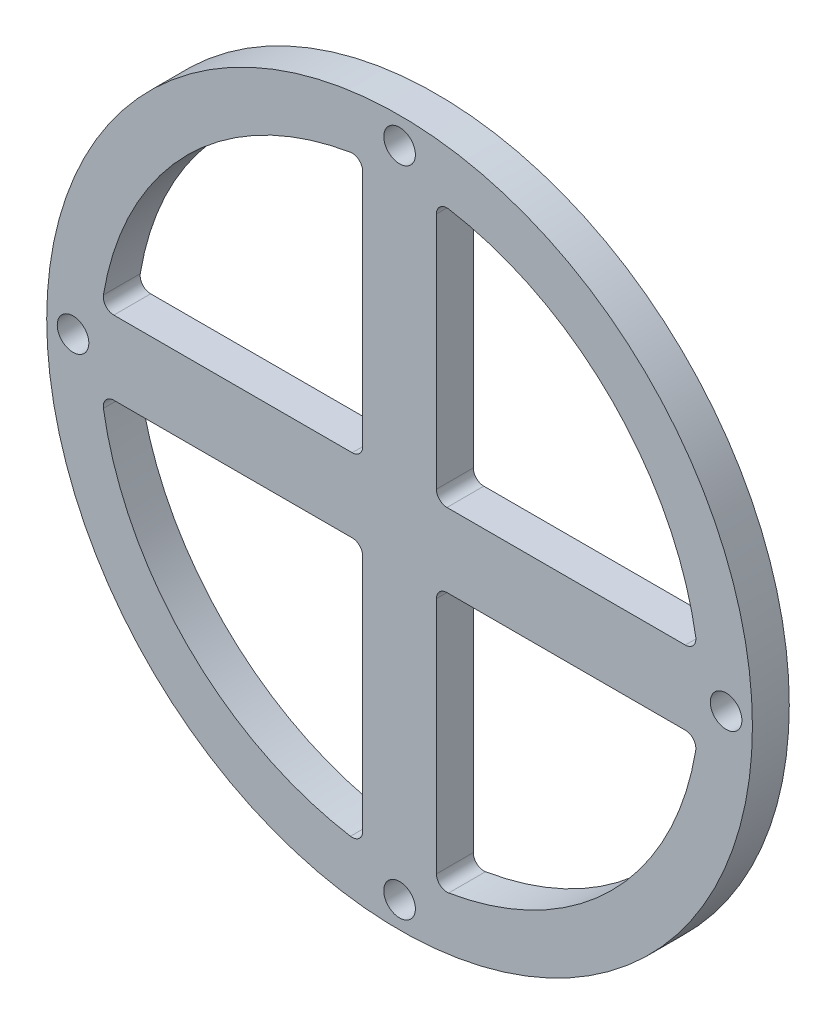
ISO-10303-21;
HEADER;
FILE_DESCRIPTION(('STEP AP214'),'2;1');
FILE_NAME('part.step','',(''),(''),'','','');
FILE_SCHEMA(('AUTOMOTIVE_DESIGN { 1 0 10303 214 1 1 1 1 }'));
ENDSEC;
DATA;
#1=APPLICATION_CONTEXT('core data for automotive mechanical design processes');
#2=APPLICATION_PROTOCOL_DEFINITION('international standard','automotive_design',2000,#1);
#3=PRODUCT_CONTEXT('',#1,'mechanical');
#4=PRODUCT('Part','Part','',(#3));
#5=PRODUCT_RELATED_PRODUCT_CATEGORY('part','',(#4));
#6=PRODUCT_DEFINITION_FORMATION('','',#4);
#7=PRODUCT_DEFINITION_CONTEXT('part definition',#1,'design');
#8=PRODUCT_DEFINITION('design','',#6,#7);
#9=PRODUCT_DEFINITION_SHAPE('','',#8);
#10=(LENGTH_UNIT() NAMED_UNIT(*) SI_UNIT(.MILLI.,.METRE.));
#11=(NAMED_UNIT(*) PLANE_ANGLE_UNIT() SI_UNIT($,.RADIAN.));
#12=(NAMED_UNIT(*) SI_UNIT($,.STERADIAN.) SOLID_ANGLE_UNIT());
#13=UNCERTAINTY_MEASURE_WITH_UNIT(LENGTH_MEASURE(1.E-05),#10,'distance_accuracy_value','');
#14=(GEOMETRIC_REPRESENTATION_CONTEXT(3) GLOBAL_UNCERTAINTY_ASSIGNED_CONTEXT((#13)) GLOBAL_UNIT_ASSIGNED_CONTEXT((#10,
#11,#12)) REPRESENTATION_CONTEXT('',''));
#15=CARTESIAN_POINT('',(0.,0.,0.));
#16=DIRECTION('',(0.,0.,1.));
#17=DIRECTION('',(1.,0.,0.));
#18=AXIS2_PLACEMENT_3D('',#15,#16,#17);
#19=CARTESIAN_POINT('',(0.,0.,7.));
#20=DIRECTION('',(0.,0.,-1.));
#21=DIRECTION('',(-1.,0.,0.));
#22=AXIS2_PLACEMENT_3D('',#19,#20,#21);
#23=CYLINDRICAL_SURFACE('',#22,57.);
#24=CARTESIAN_POINT('',(0.,0.,0.));
#25=DIRECTION('',(0.,0.,1.));
#26=DIRECTION('',(1.,0.,0.));
#27=AXIS2_PLACEMENT_3D('',#24,#25,#26);
#28=CIRCLE('',#27,57.);
#29=CARTESIAN_POINT('',(-56.2316813146386,-9.3272727272727,0.));
#30=VERTEX_POINT('',#29);
#31=CARTESIAN_POINT('',(-9.32727272727235,-56.2316813146386,0.));
#32=VERTEX_POINT('',#31);
#33=EDGE_CURVE('E289',#30,#32,#28,.T.);
#34=ORIENTED_EDGE('',*,*,#33,.F.);
#35=DIRECTION('',(0.,0.,-1.));
#36=VECTOR('',#35,1.);
#37=CARTESIAN_POINT('',(-56.2316813146386,-9.3272727272727,7.));
#38=LINE('',#37,#36);
#39=CARTESIAN_POINT('',(-56.2316813146386,-9.3272727272727,7.));
#40=VERTEX_POINT('',#39);
#41=EDGE_CURVE('E11',#40,#30,#38,.T.);
#42=ORIENTED_EDGE('',*,*,#41,.F.);
#43=CARTESIAN_POINT('',(0.,0.,7.));
#44=DIRECTION('',(0.,0.,1.));
#45=DIRECTION('',(1.,0.,0.));
#46=AXIS2_PLACEMENT_3D('',#43,#44,#45);
#47=CIRCLE('',#46,57.);
#48=CARTESIAN_POINT('',(-9.32727272727235,-56.2316813146386,7.));
#49=VERTEX_POINT('',#48);
#50=EDGE_CURVE('E418',#40,#49,#47,.T.);
#51=ORIENTED_EDGE('',*,*,#50,.T.);
#52=DIRECTION('',(0.,0.,-1.));
#53=VECTOR('',#52,1.);
#54=CARTESIAN_POINT('',(-9.32727272727235,-56.2316813146386,7.));
#55=LINE('',#54,#53);
#56=EDGE_CURVE('E54',#49,#32,#55,.T.);
#57=ORIENTED_EDGE('',*,*,#56,.T.);
#58=EDGE_LOOP('',(#34,#42,#51,#57));
#59=FACE_BOUND('',#58,.T.);
#60=ADVANCED_FACE('F35',(#59),#23,.F.);
#61=CARTESIAN_POINT('',(-54.2586398650022,-9.,7.));
#62=DIRECTION('',(0.,0.,-1.));
#63=DIRECTION('',(-1.,0.,0.));
#64=AXIS2_PLACEMENT_3D('',#61,#62,#63);
#65=CYLINDRICAL_SURFACE('',#64,2.00000000000001);
#66=CARTESIAN_POINT('',(-54.2586398650022,-9.,0.));
#67=DIRECTION('',(0.,0.,1.));
#68=DIRECTION('',(1.,0.,0.));
#69=AXIS2_PLACEMENT_3D('',#66,#67,#68);
#70=CIRCLE('',#69,2.00000000000001);
#71=CARTESIAN_POINT('',(-54.2586398650022,-7.,0.));
#72=VERTEX_POINT('',#71);
#73=EDGE_CURVE('E291',#30,#72,#70,.F.);
#74=ORIENTED_EDGE('',*,*,#73,.T.);
#75=DIRECTION('',(0.,0.,-1.));
#76=VECTOR('',#75,1.);
#77=CARTESIAN_POINT('',(-54.2586398650022,-7.,7.));
#78=LINE('',#77,#76);
#79=CARTESIAN_POINT('',(-54.2586398650022,-7.,7.));
#80=VERTEX_POINT('',#79);
#81=EDGE_CURVE('E45',#80,#72,#78,.T.);
#82=ORIENTED_EDGE('',*,*,#81,.F.);
#83=CARTESIAN_POINT('',(-54.2586398650022,-9.,7.));
#84=DIRECTION('',(0.,0.,1.));
#85=DIRECTION('',(1.,0.,0.));
#86=AXIS2_PLACEMENT_3D('',#83,#84,#85);
#87=CIRCLE('',#86,2.00000000000001);
#88=EDGE_CURVE('E227',#40,#80,#87,.F.);
#89=ORIENTED_EDGE('',*,*,#88,.F.);
#90=ORIENTED_EDGE('',*,*,#41,.T.);
#91=EDGE_LOOP('',(#74,#82,#89,#90));
#92=FACE_BOUND('',#91,.T.);
#93=ADVANCED_FACE('F422',(#92),#65,.F.);
#94=CARTESIAN_POINT('',(0.,-7.,7.));
#95=DIRECTION('',(0.,-1.,0.));
#96=DIRECTION('',(1.,0.,0.));
#97=AXIS2_PLACEMENT_3D('',#94,#95,#96);
#98=PLANE('',#97);
#99=DIRECTION('',(-1.,0.,0.));
#100=VECTOR('',#99,1.);
#101=CARTESIAN_POINT('',(0.,-7.,0.));
#102=LINE('',#101,#100);
#103=CARTESIAN_POINT('',(-8.99999999999979,-7.,0.));
#104=VERTEX_POINT('',#103);
#105=EDGE_CURVE('E294',#104,#72,#102,.T.);
#106=ORIENTED_EDGE('',*,*,#105,.F.);
#107=DIRECTION('',(0.,0.,-1.));
#108=VECTOR('',#107,1.);
#109=CARTESIAN_POINT('',(-8.99999999999979,-7.,7.));
#110=LINE('',#109,#108);
#111=CARTESIAN_POINT('',(-8.99999999999979,-7.,7.));
#112=VERTEX_POINT('',#111);
#113=EDGE_CURVE('E213',#112,#104,#110,.T.);
#114=ORIENTED_EDGE('',*,*,#113,.F.);
#115=DIRECTION('',(-1.,0.,0.));
#116=VECTOR('',#115,1.);
#117=CARTESIAN_POINT('',(0.,-7.,7.));
#118=LINE('',#117,#116);
#119=EDGE_CURVE('E225',#112,#80,#118,.T.);
#120=ORIENTED_EDGE('',*,*,#119,.T.);
#121=ORIENTED_EDGE('',*,*,#81,.T.);
#122=EDGE_LOOP('',(#106,#114,#120,#121));
#123=FACE_BOUND('',#122,.T.);
#124=ADVANCED_FACE('F426',(#123),#98,.T.);
#125=CARTESIAN_POINT('',(-8.99999999999977,-9.,7.));
#126=DIRECTION('',(0.,0.,-1.));
#127=DIRECTION('',(-1.,0.,0.));
#128=AXIS2_PLACEMENT_3D('',#125,#126,#127);
#129=CYLINDRICAL_SURFACE('',#128,2.);
#130=CARTESIAN_POINT('',(-8.99999999999977,-9.,0.));
#131=DIRECTION('',(0.,0.,1.));
#132=DIRECTION('',(1.,0.,0.));
#133=AXIS2_PLACEMENT_3D('',#130,#131,#132);
#134=CIRCLE('',#133,2.);
#135=CARTESIAN_POINT('',(-6.99999999999977,-9.00000000000001,0.));
#136=VERTEX_POINT('',#135);
#137=EDGE_CURVE('E210',#136,#104,#134,.T.);
#138=ORIENTED_EDGE('',*,*,#137,.F.);
#139=DIRECTION('',(0.,0.,-1.));
#140=VECTOR('',#139,1.);
#141=CARTESIAN_POINT('',(-6.99999999999977,-9.00000000000001,7.));
#142=LINE('',#141,#140);
#143=CARTESIAN_POINT('',(-6.99999999999977,-9.00000000000001,7.));
#144=VERTEX_POINT('',#143);
#145=EDGE_CURVE('E204',#144,#136,#142,.T.);
#146=ORIENTED_EDGE('',*,*,#145,.F.);
#147=CARTESIAN_POINT('',(-8.99999999999977,-9.,7.));
#148=DIRECTION('',(0.,0.,1.));
#149=DIRECTION('',(1.,0.,0.));
#150=AXIS2_PLACEMENT_3D('',#147,#148,#149);
#151=CIRCLE('',#150,2.);
#152=EDGE_CURVE('E208',#144,#112,#151,.T.);
#153=ORIENTED_EDGE('',*,*,#152,.T.);
#154=ORIENTED_EDGE('',*,*,#113,.T.);
#155=EDGE_LOOP('',(#138,#146,#153,#154));
#156=FACE_BOUND('',#155,.T.);
#157=ADVANCED_FACE('F206',(#156),#129,.F.);
#158=CARTESIAN_POINT('',(-6.9999999999998,0.,7.));
#159=DIRECTION('',(1.,0.,0.));
#160=DIRECTION('',(0.,1.,0.));
#161=AXIS2_PLACEMENT_3D('',#158,#159,#160);
#162=PLANE('',#161);
#163=DIRECTION('',(0.,-1.,0.));
#164=VECTOR('',#163,1.);
#165=CARTESIAN_POINT('',(-6.9999999999998,0.,0.));
#166=LINE('',#165,#164);
#167=CARTESIAN_POINT('',(-6.99999999999962,-54.2586398650022,0.));
#168=VERTEX_POINT('',#167);
#169=EDGE_CURVE('E298',#136,#168,#166,.T.);
#170=ORIENTED_EDGE('',*,*,#169,.T.);
#171=DIRECTION('',(0.,0.,-1.));
#172=VECTOR('',#171,1.);
#173=CARTESIAN_POINT('',(-6.99999999999962,-54.2586398650022,7.));
#174=LINE('',#173,#172);
#175=CARTESIAN_POINT('',(-6.99999999999962,-54.2586398650022,7.));
#176=VERTEX_POINT('',#175);
#177=EDGE_CURVE('E128',#176,#168,#174,.T.);
#178=ORIENTED_EDGE('',*,*,#177,.F.);
#179=DIRECTION('',(0.,-1.,0.));
#180=VECTOR('',#179,1.);
#181=CARTESIAN_POINT('',(-6.9999999999998,0.,7.));
#182=LINE('',#181,#180);
#183=EDGE_CURVE('E215',#144,#176,#182,.T.);
#184=ORIENTED_EDGE('',*,*,#183,.F.);
#185=ORIENTED_EDGE('',*,*,#145,.T.);
#186=EDGE_LOOP('',(#170,#178,#184,#185));
#187=FACE_BOUND('',#186,.T.);
#188=ADVANCED_FACE('F216',(#187),#162,.F.);
#189=CARTESIAN_POINT('',(8.99999999999999,-54.2586398650022,7.));
#190=DIRECTION('',(0.,0.,-1.));
#191=DIRECTION('',(-1.,0.,0.));
#192=AXIS2_PLACEMENT_3D('',#189,#190,#191);
#193=CYLINDRICAL_SURFACE('',#192,2.00000000000001);
#194=CARTESIAN_POINT('',(8.99999999999999,-54.2586398650022,0.));
#195=DIRECTION('',(0.,0.,1.));
#196=DIRECTION('',(1.,0.,0.));
#197=AXIS2_PLACEMENT_3D('',#194,#195,#196);
#198=CIRCLE('',#197,2.00000000000001);
#199=CARTESIAN_POINT('',(6.99999999999999,-54.2586398650022,0.));
#200=VERTEX_POINT('',#199);
#201=CARTESIAN_POINT('',(9.32727272727273,-56.2316813146386,0.));
#202=VERTEX_POINT('',#201);
#203=EDGE_CURVE('E268',#200,#202,#198,.T.);
#204=ORIENTED_EDGE('',*,*,#203,.F.);
#205=DIRECTION('',(0.,0.,-1.));
#206=VECTOR('',#205,1.);
#207=CARTESIAN_POINT('',(6.99999999999999,-54.2586398650022,7.));
#208=LINE('',#207,#206);
#209=CARTESIAN_POINT('',(6.99999999999999,-54.2586398650022,7.));
#210=VERTEX_POINT('',#209);
#211=EDGE_CURVE('E305',#210,#200,#208,.T.);
#212=ORIENTED_EDGE('',*,*,#211,.F.);
#213=CARTESIAN_POINT('',(8.99999999999999,-54.2586398650022,7.));
#214=DIRECTION('',(0.,0.,1.));
#215=DIRECTION('',(1.,0.,0.));
#216=AXIS2_PLACEMENT_3D('',#213,#214,#215);
#217=CIRCLE('',#216,2.00000000000001);
#218=CARTESIAN_POINT('',(9.32727272727273,-56.2316813146386,7.));
#219=VERTEX_POINT('',#218);
#220=EDGE_CURVE('E399',#210,#219,#217,.T.);
#221=ORIENTED_EDGE('',*,*,#220,.T.);
#222=DIRECTION('',(0.,0.,-1.));
#223=VECTOR('',#222,1.);
#224=CARTESIAN_POINT('',(9.32727272727273,-56.2316813146386,7.));
#225=LINE('',#224,#223);
#226=EDGE_CURVE('E309',#219,#202,#225,.T.);
#227=ORIENTED_EDGE('',*,*,#226,.T.);
#228=EDGE_LOOP('',(#204,#212,#221,#227));
#229=FACE_BOUND('',#228,.T.);
#230=ADVANCED_FACE('F473',(#229),#193,.F.);
#231=CARTESIAN_POINT('',(6.99999999999981,0.,7.));
#232=DIRECTION('',(-1.,0.,0.));
#233=DIRECTION('',(0.,-1.,0.));
#234=AXIS2_PLACEMENT_3D('',#231,#232,#233);
#235=PLANE('',#234);
#236=DIRECTION('',(0.,1.,0.));
#237=VECTOR('',#236,1.);
#238=CARTESIAN_POINT('',(6.99999999999981,0.,0.));
#239=LINE('',#238,#237);
#240=CARTESIAN_POINT('',(6.99999999999984,-9.00000000000002,0.));
#241=VERTEX_POINT('',#240);
#242=EDGE_CURVE('E271',#200,#241,#239,.T.);
#243=ORIENTED_EDGE('',*,*,#242,.T.);
#244=DIRECTION('',(0.,0.,-1.));
#245=VECTOR('',#244,1.);
#246=CARTESIAN_POINT('',(6.99999999999984,-9.00000000000002,7.));
#247=LINE('',#246,#245);
#248=CARTESIAN_POINT('',(6.99999999999984,-9.00000000000002,7.));
#249=VERTEX_POINT('',#248);
#250=EDGE_CURVE('E318',#249,#241,#247,.T.);
#251=ORIENTED_EDGE('',*,*,#250,.F.);
#252=DIRECTION('',(0.,1.,0.));
#253=VECTOR('',#252,1.);
#254=CARTESIAN_POINT('',(6.99999999999981,0.,7.));
#255=LINE('',#254,#253);
#256=EDGE_CURVE('E402',#210,#249,#255,.T.);
#257=ORIENTED_EDGE('',*,*,#256,.F.);
#258=ORIENTED_EDGE('',*,*,#211,.T.);
#259=EDGE_LOOP('',(#243,#251,#257,#258));
#260=FACE_BOUND('',#259,.T.);
#261=ADVANCED_FACE('F469',(#260),#235,.F.);
#262=CARTESIAN_POINT('',(8.99999999999984,-9.,7.));
#263=DIRECTION('',(0.,0.,-1.));
#264=DIRECTION('',(-1.,0.,0.));
#265=AXIS2_PLACEMENT_3D('',#262,#263,#264);
#266=CYLINDRICAL_SURFACE('',#265,2.);
#267=CARTESIAN_POINT('',(8.99999999999984,-9.,0.));
#268=DIRECTION('',(0.,0.,1.));
#269=DIRECTION('',(1.,0.,0.));
#270=AXIS2_PLACEMENT_3D('',#267,#268,#269);
#271=CIRCLE('',#270,2.);
#272=CARTESIAN_POINT('',(8.99999999999985,-7.,0.));
#273=VERTEX_POINT('',#272);
#274=EDGE_CURVE('E274',#241,#273,#271,.F.);
#275=ORIENTED_EDGE('',*,*,#274,.T.);
#276=DIRECTION('',(0.,0.,-1.));
#277=VECTOR('',#276,1.);
#278=CARTESIAN_POINT('',(8.99999999999985,-7.,7.));
#279=LINE('',#278,#277);
#280=CARTESIAN_POINT('',(8.99999999999985,-7.,7.));
#281=VERTEX_POINT('',#280);
#282=EDGE_CURVE('E316',#281,#273,#279,.T.);
#283=ORIENTED_EDGE('',*,*,#282,.F.);
#284=CARTESIAN_POINT('',(8.99999999999984,-9.,7.));
#285=DIRECTION('',(0.,0.,1.));
#286=DIRECTION('',(1.,0.,0.));
#287=AXIS2_PLACEMENT_3D('',#284,#285,#286);
#288=CIRCLE('',#287,2.);
#289=EDGE_CURVE('E405',#249,#281,#288,.F.);
#290=ORIENTED_EDGE('',*,*,#289,.F.);
#291=ORIENTED_EDGE('',*,*,#250,.T.);
#292=EDGE_LOOP('',(#275,#283,#290,#291));
#293=FACE_BOUND('',#292,.T.);
#294=ADVANCED_FACE('F465',(#293),#266,.F.);
#295=CARTESIAN_POINT('',(0.,-7.,7.));
#296=DIRECTION('',(0.,-1.,0.));
#297=DIRECTION('',(1.,0.,0.));
#298=AXIS2_PLACEMENT_3D('',#295,#296,#297);
#299=PLANE('',#298);
#300=DIRECTION('',(-1.,0.,0.));
#301=VECTOR('',#300,1.);
#302=CARTESIAN_POINT('',(0.,-7.,0.));
#303=LINE('',#302,#301);
#304=CARTESIAN_POINT('',(54.2586398650021,-7.,0.));
#305=VERTEX_POINT('',#304);
#306=EDGE_CURVE('E277',#305,#273,#303,.T.);
#307=ORIENTED_EDGE('',*,*,#306,.F.);
#308=DIRECTION('',(0.,0.,-1.));
#309=VECTOR('',#308,1.);
#310=CARTESIAN_POINT('',(54.2586398650021,-7.,7.));
#311=LINE('',#310,#309);
#312=CARTESIAN_POINT('',(54.2586398650021,-7.,7.));
#313=VERTEX_POINT('',#312);
#314=EDGE_CURVE('E314',#313,#305,#311,.T.);
#315=ORIENTED_EDGE('',*,*,#314,.F.);
#316=DIRECTION('',(-1.,0.,0.));
#317=VECTOR('',#316,1.);
#318=CARTESIAN_POINT('',(0.,-7.,7.));
#319=LINE('',#318,#317);
#320=EDGE_CURVE('E407',#313,#281,#319,.T.);
#321=ORIENTED_EDGE('',*,*,#320,.T.);
#322=ORIENTED_EDGE('',*,*,#282,.T.);
#323=EDGE_LOOP('',(#307,#315,#321,#322));
#324=FACE_BOUND('',#323,.T.);
#325=ADVANCED_FACE('F461',(#324),#299,.T.);
#326=CARTESIAN_POINT('',(54.2586398650021,-9.,7.));
#327=DIRECTION('',(0.,0.,-1.));
#328=DIRECTION('',(-1.,0.,0.));
#329=AXIS2_PLACEMENT_3D('',#326,#327,#328);
#330=CYLINDRICAL_SURFACE('',#329,2.);
#331=CARTESIAN_POINT('',(54.2586398650021,-9.,0.));
#332=DIRECTION('',(0.,0.,1.));
#333=DIRECTION('',(1.,0.,0.));
#334=AXIS2_PLACEMENT_3D('',#331,#332,#333);
#335=CIRCLE('',#334,2.);
#336=CARTESIAN_POINT('',(56.2316813146386,-9.32727272727275,0.));
#337=VERTEX_POINT('',#336);
#338=EDGE_CURVE('E280',#305,#337,#335,.F.);
#339=ORIENTED_EDGE('',*,*,#338,.T.);
#340=DIRECTION('',(0.,0.,-1.));
#341=VECTOR('',#340,1.);
#342=CARTESIAN_POINT('',(56.2316813146386,-9.32727272727275,7.));
#343=LINE('',#342,#341);
#344=CARTESIAN_POINT('',(56.2316813146386,-9.32727272727275,7.));
#345=VERTEX_POINT('',#344);
#346=EDGE_CURVE('E311',#345,#337,#343,.T.);
#347=ORIENTED_EDGE('',*,*,#346,.F.);
#348=CARTESIAN_POINT('',(54.2586398650021,-9.,7.));
#349=DIRECTION('',(0.,0.,1.));
#350=DIRECTION('',(1.,0.,0.));
#351=AXIS2_PLACEMENT_3D('',#348,#349,#350);
#352=CIRCLE('',#351,2.);
#353=EDGE_CURVE('E410',#313,#345,#352,.F.);
#354=ORIENTED_EDGE('',*,*,#353,.F.);
#355=ORIENTED_EDGE('',*,*,#314,.T.);
#356=EDGE_LOOP('',(#339,#347,#354,#355));
#357=FACE_BOUND('',#356,.T.);
#358=ADVANCED_FACE('F457',(#357),#330,.F.);
#359=CARTESIAN_POINT('',(8.99999999999978,9.,7.));
#360=DIRECTION('',(0.,0.,-1.));
#361=DIRECTION('',(-1.,0.,0.));
#362=AXIS2_PLACEMENT_3D('',#359,#360,#361);
#363=CYLINDRICAL_SURFACE('',#362,2.);
#364=CARTESIAN_POINT('',(8.99999999999978,9.,0.));
#365=DIRECTION('',(0.,0.,1.));
#366=DIRECTION('',(1.,0.,0.));
#367=AXIS2_PLACEMENT_3D('',#364,#365,#366);
#368=CIRCLE('',#367,2.);
#369=CARTESIAN_POINT('',(6.99999999999978,9.00000000000001,0.));
#370=VERTEX_POINT('',#369);
#371=CARTESIAN_POINT('',(8.99999999999979,7.,0.));
#372=VERTEX_POINT('',#371);
#373=EDGE_CURVE('E250',#370,#372,#368,.T.);
#374=ORIENTED_EDGE('',*,*,#373,.F.);
#375=DIRECTION('',(0.,0.,-1.));
#376=VECTOR('',#375,1.);
#377=CARTESIAN_POINT('',(6.99999999999978,9.00000000000001,7.));
#378=LINE('',#377,#376);
#379=CARTESIAN_POINT('',(6.99999999999978,9.00000000000001,7.));
#380=VERTEX_POINT('',#379);
#381=EDGE_CURVE('E312',#380,#370,#378,.T.);
#382=ORIENTED_EDGE('',*,*,#381,.F.);
#383=CARTESIAN_POINT('',(8.99999999999978,9.,7.));
#384=DIRECTION('',(0.,0.,1.));
#385=DIRECTION('',(1.,0.,0.));
#386=AXIS2_PLACEMENT_3D('',#383,#384,#385);
#387=CIRCLE('',#386,2.);
#388=CARTESIAN_POINT('',(8.99999999999979,7.,7.));
#389=VERTEX_POINT('',#388);
#390=EDGE_CURVE('E383',#380,#389,#387,.T.);
#391=ORIENTED_EDGE('',*,*,#390,.T.);
#392=DIRECTION('',(0.,0.,-1.));
#393=VECTOR('',#392,1.);
#394=CARTESIAN_POINT('',(8.99999999999979,7.,7.));
#395=LINE('',#394,#393);
#396=EDGE_CURVE('E322',#389,#372,#395,.T.);
#397=ORIENTED_EDGE('',*,*,#396,.T.);
#398=EDGE_LOOP('',(#374,#382,#391,#397));
#399=FACE_BOUND('',#398,.T.);
#400=ADVANCED_FACE('F460',(#399),#363,.F.);
#401=CARTESIAN_POINT('',(6.99999999999981,0.,7.));
#402=DIRECTION('',(-1.,0.,0.));
#403=DIRECTION('',(0.,-1.,0.));
#404=AXIS2_PLACEMENT_3D('',#401,#402,#403);
#405=PLANE('',#404);
#406=DIRECTION('',(0.,1.,0.));
#407=VECTOR('',#406,1.);
#408=CARTESIAN_POINT('',(6.99999999999981,0.,0.));
#409=LINE('',#408,#407);
#410=CARTESIAN_POINT('',(6.99999999999962,54.2586398650022,0.));
#411=VERTEX_POINT('',#410);
#412=EDGE_CURVE('E253',#370,#411,#409,.T.);
#413=ORIENTED_EDGE('',*,*,#412,.T.);
#414=DIRECTION('',(0.,0.,-1.));
#415=VECTOR('',#414,1.);
#416=CARTESIAN_POINT('',(6.99999999999962,54.2586398650022,7.));
#417=LINE('',#416,#415);
#418=CARTESIAN_POINT('',(6.99999999999962,54.2586398650022,7.));
#419=VERTEX_POINT('',#418);
#420=EDGE_CURVE('E330',#419,#411,#417,.T.);
#421=ORIENTED_EDGE('',*,*,#420,.F.);
#422=DIRECTION('',(0.,1.,0.));
#423=VECTOR('',#422,1.);
#424=CARTESIAN_POINT('',(6.99999999999981,0.,7.));
#425=LINE('',#424,#423);
#426=EDGE_CURVE('E386',#380,#419,#425,.T.);
#427=ORIENTED_EDGE('',*,*,#426,.F.);
#428=ORIENTED_EDGE('',*,*,#381,.T.);
#429=EDGE_LOOP('',(#413,#421,#427,#428));
#430=FACE_BOUND('',#429,.T.);
#431=ADVANCED_FACE('F492',(#430),#405,.F.);
#432=CARTESIAN_POINT('',(8.99999999999962,54.2586398650022,7.));
#433=DIRECTION('',(0.,0.,-1.));
#434=DIRECTION('',(-1.,0.,0.));
#435=AXIS2_PLACEMENT_3D('',#432,#433,#434);
#436=CYLINDRICAL_SURFACE('',#435,2.00000000000001);
#437=CARTESIAN_POINT('',(8.99999999999962,54.2586398650022,0.));
#438=DIRECTION('',(0.,0.,1.));
#439=DIRECTION('',(1.,0.,0.));
#440=AXIS2_PLACEMENT_3D('',#437,#438,#439);
#441=CIRCLE('',#440,2.00000000000001);
#442=CARTESIAN_POINT('',(9.32727272727234,56.2316813146386,0.));
#443=VERTEX_POINT('',#442);
#444=EDGE_CURVE('E256',#443,#411,#441,.T.);
#445=ORIENTED_EDGE('',*,*,#444,.F.);
#446=DIRECTION('',(0.,0.,-1.));
#447=VECTOR('',#446,1.);
#448=CARTESIAN_POINT('',(9.32727272727234,56.2316813146386,7.));
#449=LINE('',#448,#447);
#450=CARTESIAN_POINT('',(9.32727272727234,56.2316813146386,7.));
#451=VERTEX_POINT('',#450);
#452=EDGE_CURVE('E328',#451,#443,#449,.T.);
#453=ORIENTED_EDGE('',*,*,#452,.F.);
#454=CARTESIAN_POINT('',(8.99999999999962,54.2586398650022,7.));
#455=DIRECTION('',(0.,0.,1.));
#456=DIRECTION('',(1.,0.,0.));
#457=AXIS2_PLACEMENT_3D('',#454,#455,#456);
#458=CIRCLE('',#457,2.00000000000001);
#459=EDGE_CURVE('E388',#451,#419,#458,.T.);
#460=ORIENTED_EDGE('',*,*,#459,.T.);
#461=ORIENTED_EDGE('',*,*,#420,.T.);
#462=EDGE_LOOP('',(#445,#453,#460,#461));
#463=FACE_BOUND('',#462,.T.);
#464=ADVANCED_FACE('F488',(#463),#436,.F.);
#465=CARTESIAN_POINT('',(0.,0.,7.));
#466=DIRECTION('',(0.,0.,-1.));
#467=DIRECTION('',(-1.,0.,0.));
#468=AXIS2_PLACEMENT_3D('',#465,#466,#467);
#469=CYLINDRICAL_SURFACE('',#468,57.);
#470=CARTESIAN_POINT('',(0.,0.,0.));
#471=DIRECTION('',(0.,0.,1.));
#472=DIRECTION('',(1.,0.,0.));
#473=AXIS2_PLACEMENT_3D('',#470,#471,#472);
#474=CIRCLE('',#473,57.);
#475=CARTESIAN_POINT('',(56.2316813146386,9.32727272727273,0.));
#476=VERTEX_POINT('',#475);
#477=EDGE_CURVE('E259',#476,#443,#474,.T.);
#478=ORIENTED_EDGE('',*,*,#477,.F.);
#479=DIRECTION('',(0.,0.,-1.));
#480=VECTOR('',#479,1.);
#481=CARTESIAN_POINT('',(56.2316813146386,9.32727272727273,7.));
#482=LINE('',#481,#480);
#483=CARTESIAN_POINT('',(56.2316813146386,9.32727272727273,7.));
#484=VERTEX_POINT('',#483);
#485=EDGE_CURVE('E326',#484,#476,#482,.T.);
#486=ORIENTED_EDGE('',*,*,#485,.F.);
#487=CARTESIAN_POINT('',(0.,0.,7.));
#488=DIRECTION('',(0.,0.,1.));
#489=DIRECTION('',(1.,0.,0.));
#490=AXIS2_PLACEMENT_3D('',#487,#488,#489);
#491=CIRCLE('',#490,57.);
#492=EDGE_CURVE('E391',#484,#451,#491,.T.);
#493=ORIENTED_EDGE('',*,*,#492,.T.);
#494=ORIENTED_EDGE('',*,*,#452,.T.);
#495=EDGE_LOOP('',(#478,#486,#493,#494));
#496=FACE_BOUND('',#495,.T.);
#497=ADVANCED_FACE('F484',(#496),#469,.F.);
#498=CARTESIAN_POINT('',(54.2586398650021,9.,7.));
#499=DIRECTION('',(0.,0.,-1.));
#500=DIRECTION('',(-1.,0.,0.));
#501=AXIS2_PLACEMENT_3D('',#498,#499,#500);
#502=CYLINDRICAL_SURFACE('',#501,2.);
#503=CARTESIAN_POINT('',(54.2586398650021,9.,0.));
#504=DIRECTION('',(0.,0.,1.));
#505=DIRECTION('',(1.,0.,0.));
#506=AXIS2_PLACEMENT_3D('',#503,#504,#505);
#507=CIRCLE('',#506,2.);
#508=CARTESIAN_POINT('',(54.2586398650021,7.,0.));
#509=VERTEX_POINT('',#508);
#510=EDGE_CURVE('E262',#509,#476,#507,.T.);
#511=ORIENTED_EDGE('',*,*,#510,.F.);
#512=DIRECTION('',(0.,0.,-1.));
#513=VECTOR('',#512,1.);
#514=CARTESIAN_POINT('',(54.2586398650021,7.,7.));
#515=LINE('',#514,#513);
#516=CARTESIAN_POINT('',(54.2586398650021,7.,7.));
#517=VERTEX_POINT('',#516);
#518=EDGE_CURVE('E324',#517,#509,#515,.T.);
#519=ORIENTED_EDGE('',*,*,#518,.F.);
#520=CARTESIAN_POINT('',(54.2586398650021,9.,7.));
#521=DIRECTION('',(0.,0.,1.));
#522=DIRECTION('',(1.,0.,0.));
#523=AXIS2_PLACEMENT_3D('',#520,#521,#522);
#524=CIRCLE('',#523,2.);
#525=EDGE_CURVE('E394',#517,#484,#524,.T.);
#526=ORIENTED_EDGE('',*,*,#525,.T.);
#527=ORIENTED_EDGE('',*,*,#485,.T.);
#528=EDGE_LOOP('',(#511,#519,#526,#527));
#529=FACE_BOUND('',#528,.T.);
#530=ADVANCED_FACE('F481',(#529),#502,.F.);
#531=CARTESIAN_POINT('',(-9.,54.2586398650021,7.));
#532=DIRECTION('',(0.,0.,-1.));
#533=DIRECTION('',(-1.,0.,0.));
#534=AXIS2_PLACEMENT_3D('',#531,#532,#533);
#535=CYLINDRICAL_SURFACE('',#534,2.);
#536=CARTESIAN_POINT('',(-9.,54.2586398650021,0.));
#537=DIRECTION('',(0.,0.,1.));
#538=DIRECTION('',(1.,0.,0.));
#539=AXIS2_PLACEMENT_3D('',#536,#537,#538);
#540=CIRCLE('',#539,2.);
#541=CARTESIAN_POINT('',(-7.,54.2586398650021,0.));
#542=VERTEX_POINT('',#541);
#543=CARTESIAN_POINT('',(-9.32727272727273,56.2316813146386,0.));
#544=VERTEX_POINT('',#543);
#545=EDGE_CURVE('E233',#542,#544,#540,.T.);
#546=ORIENTED_EDGE('',*,*,#545,.F.);
#547=DIRECTION('',(0.,0.,-1.));
#548=VECTOR('',#547,1.);
#549=CARTESIAN_POINT('',(-7.,54.2586398650021,7.));
#550=LINE('',#549,#548);
#551=CARTESIAN_POINT('',(-7.,54.2586398650021,7.));
#552=VERTEX_POINT('',#551);
#553=EDGE_CURVE('E39',#552,#542,#550,.T.);
#554=ORIENTED_EDGE('',*,*,#553,.F.);
#555=CARTESIAN_POINT('',(-9.,54.2586398650021,7.));
#556=DIRECTION('',(0.,0.,1.));
#557=DIRECTION('',(1.,0.,0.));
#558=AXIS2_PLACEMENT_3D('',#555,#556,#557);
#559=CIRCLE('',#558,2.);
#560=CARTESIAN_POINT('',(-9.32727272727273,56.2316813146386,7.));
#561=VERTEX_POINT('',#560);
#562=EDGE_CURVE('E303',#552,#561,#559,.T.);
#563=ORIENTED_EDGE('',*,*,#562,.T.);
#564=DIRECTION('',(0.,0.,-1.));
#565=VECTOR('',#564,1.);
#566=CARTESIAN_POINT('',(-9.32727272727273,56.2316813146386,7.));
#567=LINE('',#566,#565);
#568=EDGE_CURVE('E232',#561,#544,#567,.T.);
#569=ORIENTED_EDGE('',*,*,#568,.T.);
#570=EDGE_LOOP('',(#546,#554,#563,#569));
#571=FACE_BOUND('',#570,.T.);
#572=ADVANCED_FACE('F37',(#571),#535,.F.);
#573=CARTESIAN_POINT('',(-7.,0.,7.));
#574=DIRECTION('',(1.,0.,0.));
#575=DIRECTION('',(0.,1.,0.));
#576=AXIS2_PLACEMENT_3D('',#573,#574,#575);
#577=PLANE('',#576);
#578=DIRECTION('',(0.,-1.,0.));
#579=VECTOR('',#578,1.);
#580=CARTESIAN_POINT('',(-7.,0.,0.));
#581=LINE('',#580,#579);
#582=CARTESIAN_POINT('',(-7.,9.00000000000001,0.));
#583=VERTEX_POINT('',#582);
#584=EDGE_CURVE('E236',#542,#583,#581,.T.);
#585=ORIENTED_EDGE('',*,*,#584,.T.);
#586=DIRECTION('',(0.,0.,-1.));
#587=VECTOR('',#586,1.);
#588=CARTESIAN_POINT('',(-7.,9.00000000000001,7.));
#589=LINE('',#588,#587);
#590=CARTESIAN_POINT('',(-7.,9.00000000000001,7.));
#591=VERTEX_POINT('',#590);
#592=EDGE_CURVE('E340',#591,#583,#589,.T.);
#593=ORIENTED_EDGE('',*,*,#592,.F.);
#594=DIRECTION('',(0.,-1.,0.));
#595=VECTOR('',#594,1.);
#596=CARTESIAN_POINT('',(-7.,0.,7.));
#597=LINE('',#596,#595);
#598=EDGE_CURVE('E349',#552,#591,#597,.T.);
#599=ORIENTED_EDGE('',*,*,#598,.F.);
#600=ORIENTED_EDGE('',*,*,#553,.T.);
#601=EDGE_LOOP('',(#585,#593,#599,#600));
#602=FACE_BOUND('',#601,.T.);
#603=ADVANCED_FACE('F348',(#602),#577,.F.);
#604=CARTESIAN_POINT('',(-9.,9.,7.));
#605=DIRECTION('',(0.,0.,-1.));
#606=DIRECTION('',(-1.,0.,0.));
#607=AXIS2_PLACEMENT_3D('',#604,#605,#606);
#608=CYLINDRICAL_SURFACE('',#607,2.);
#609=CARTESIAN_POINT('',(-9.,9.,0.));
#610=DIRECTION('',(0.,0.,1.));
#611=DIRECTION('',(1.,0.,0.));
#612=AXIS2_PLACEMENT_3D('',#609,#610,#611);
#613=CIRCLE('',#612,2.);
#614=CARTESIAN_POINT('',(-9.00000000000001,7.,0.));
#615=VERTEX_POINT('',#614);
#616=EDGE_CURVE('E239',#583,#615,#613,.F.);
#617=ORIENTED_EDGE('',*,*,#616,.T.);
#618=DIRECTION('',(0.,0.,-1.));
#619=VECTOR('',#618,1.);
#620=CARTESIAN_POINT('',(-9.00000000000001,7.,7.));
#621=LINE('',#620,#619);
#622=CARTESIAN_POINT('',(-9.00000000000001,7.,7.));
#623=VERTEX_POINT('',#622);
#624=EDGE_CURVE('E338',#623,#615,#621,.T.);
#625=ORIENTED_EDGE('',*,*,#624,.F.);
#626=CARTESIAN_POINT('',(-9.,9.,7.));
#627=DIRECTION('',(0.,0.,1.));
#628=DIRECTION('',(1.,0.,0.));
#629=AXIS2_PLACEMENT_3D('',#626,#627,#628);
#630=CIRCLE('',#629,2.);
#631=EDGE_CURVE('E374',#591,#623,#630,.F.);
#632=ORIENTED_EDGE('',*,*,#631,.F.);
#633=ORIENTED_EDGE('',*,*,#592,.T.);
#634=EDGE_LOOP('',(#617,#625,#632,#633));
#635=FACE_BOUND('',#634,.T.);
#636=ADVANCED_FACE('F373',(#635),#608,.F.);
#637=CARTESIAN_POINT('',(0.,7.,7.));
#638=DIRECTION('',(0.,-1.,0.));
#639=DIRECTION('',(1.,0.,0.));
#640=AXIS2_PLACEMENT_3D('',#637,#638,#639);
#641=PLANE('',#640);
#642=DIRECTION('',(-1.,0.,0.));
#643=VECTOR('',#642,1.);
#644=CARTESIAN_POINT('',(0.,7.,0.));
#645=LINE('',#644,#643);
#646=CARTESIAN_POINT('',(-54.2586398650021,7.,0.));
#647=VERTEX_POINT('',#646);
#648=EDGE_CURVE('E241',#615,#647,#645,.T.);
#649=ORIENTED_EDGE('',*,*,#648,.T.);
#650=DIRECTION('',(0.,0.,-1.));
#651=VECTOR('',#650,1.);
#652=CARTESIAN_POINT('',(-54.2586398650021,7.,7.));
#653=LINE('',#652,#651);
#654=CARTESIAN_POINT('',(-54.2586398650021,7.,7.));
#655=VERTEX_POINT('',#654);
#656=EDGE_CURVE('E336',#655,#647,#653,.T.);
#657=ORIENTED_EDGE('',*,*,#656,.F.);
#658=DIRECTION('',(-1.,0.,0.));
#659=VECTOR('',#658,1.);
#660=CARTESIAN_POINT('',(0.,7.,7.));
#661=LINE('',#660,#659);
#662=EDGE_CURVE('E372',#623,#655,#661,.T.);
#663=ORIENTED_EDGE('',*,*,#662,.F.);
#664=ORIENTED_EDGE('',*,*,#624,.T.);
#665=EDGE_LOOP('',(#649,#657,#663,#664));
#666=FACE_BOUND('',#665,.T.);
#667=ADVANCED_FACE('F370',(#666),#641,.F.);
#668=CARTESIAN_POINT('',(-54.2586398650021,9.,7.));
#669=DIRECTION('',(0.,0.,-1.));
#670=DIRECTION('',(-1.,0.,0.));
#671=AXIS2_PLACEMENT_3D('',#668,#669,#670);
#672=CYLINDRICAL_SURFACE('',#671,2.);
#673=CARTESIAN_POINT('',(-54.2586398650021,9.,0.));
#674=DIRECTION('',(0.,0.,1.));
#675=DIRECTION('',(1.,0.,0.));
#676=AXIS2_PLACEMENT_3D('',#673,#674,#675);
#677=CIRCLE('',#676,2.);
#678=CARTESIAN_POINT('',(-56.2316813146386,9.32727272727272,0.));
#679=VERTEX_POINT('',#678);
#680=EDGE_CURVE('E244',#679,#647,#677,.T.);
#681=ORIENTED_EDGE('',*,*,#680,.F.);
#682=DIRECTION('',(0.,0.,-1.));
#683=VECTOR('',#682,1.);
#684=CARTESIAN_POINT('',(-56.2316813146386,9.32727272727272,7.));
#685=LINE('',#684,#683);
#686=CARTESIAN_POINT('',(-56.2316813146386,9.32727272727272,7.));
#687=VERTEX_POINT('',#686);
#688=EDGE_CURVE('E334',#687,#679,#685,.T.);
#689=ORIENTED_EDGE('',*,*,#688,.F.);
#690=CARTESIAN_POINT('',(-54.2586398650021,9.,7.));
#691=DIRECTION('',(0.,0.,1.));
#692=DIRECTION('',(1.,0.,0.));
#693=AXIS2_PLACEMENT_3D('',#690,#691,#692);
#694=CIRCLE('',#693,2.);
#695=EDGE_CURVE('E367',#687,#655,#694,.T.);
#696=ORIENTED_EDGE('',*,*,#695,.T.);
#697=ORIENTED_EDGE('',*,*,#656,.T.);
#698=EDGE_LOOP('',(#681,#689,#696,#697));
#699=FACE_BOUND('',#698,.T.);
#700=ADVANCED_FACE('F363',(#699),#672,.F.);
#701=CARTESIAN_POINT('',(0.,0.,7.));
#702=DIRECTION('',(0.,0.,-1.));
#703=DIRECTION('',(-1.,0.,0.));
#704=AXIS2_PLACEMENT_3D('',#701,#702,#703);
#705=CYLINDRICAL_SURFACE('',#704,67.);
#706=CARTESIAN_POINT('',(0.,0.,7.));
#707=DIRECTION('',(0.,0.,1.));
#708=DIRECTION('',(1.,0.,0.));
#709=AXIS2_PLACEMENT_3D('',#706,#707,#708);
#710=CIRCLE('',#709,67.);
#711=CARTESIAN_POINT('',(67.,0.,7.));
#712=VERTEX_POINT('',#711);
#713=EDGE_CURVE('E415',#712,#712,#710,.T.);
#714=ORIENTED_EDGE('',*,*,#713,.F.);
#715=EDGE_LOOP('',(#714));
#716=FACE_BOUND('',#715,.T.);
#717=CARTESIAN_POINT('',(0.,0.,0.));
#718=DIRECTION('',(0.,0.,1.));
#719=DIRECTION('',(1.,0.,0.));
#720=AXIS2_PLACEMENT_3D('',#717,#718,#719);
#721=CIRCLE('',#720,67.);
#722=CARTESIAN_POINT('',(67.,0.,0.));
#723=VERTEX_POINT('',#722);
#724=EDGE_CURVE('E286',#723,#723,#721,.T.);
#725=ORIENTED_EDGE('',*,*,#724,.T.);
#726=EDGE_LOOP('',(#725));
#727=FACE_BOUND('',#726,.T.);
#728=ADVANCED_FACE('F449',(#716,#727),#705,.T.);
#729=CARTESIAN_POINT('',(0.,0.,7.));
#730=DIRECTION('',(0.,0.,-1.));
#731=DIRECTION('',(-1.,0.,0.));
#732=AXIS2_PLACEMENT_3D('',#729,#730,#731);
#733=CYLINDRICAL_SURFACE('',#732,57.);
#734=CARTESIAN_POINT('',(0.,0.,0.));
#735=DIRECTION('',(0.,0.,1.));
#736=DIRECTION('',(1.,0.,0.));
#737=AXIS2_PLACEMENT_3D('',#734,#735,#736);
#738=CIRCLE('',#737,57.);
#739=EDGE_CURVE('E283',#202,#337,#738,.T.);
#740=ORIENTED_EDGE('',*,*,#739,.F.);
#741=ORIENTED_EDGE('',*,*,#226,.F.);
#742=CARTESIAN_POINT('',(0.,0.,7.));
#743=DIRECTION('',(0.,0.,1.));
#744=DIRECTION('',(1.,0.,0.));
#745=AXIS2_PLACEMENT_3D('',#742,#743,#744);
#746=CIRCLE('',#745,57.);
#747=EDGE_CURVE('E412',#219,#345,#746,.T.);
#748=ORIENTED_EDGE('',*,*,#747,.T.);
#749=ORIENTED_EDGE('',*,*,#346,.T.);
#750=EDGE_LOOP('',(#740,#741,#748,#749));
#751=FACE_BOUND('',#750,.T.);
#752=ADVANCED_FACE('F452',(#751),#733,.F.);
#753=CARTESIAN_POINT('',(0.,7.,7.));
#754=DIRECTION('',(0.,-1.,0.));
#755=DIRECTION('',(1.,0.,0.));
#756=AXIS2_PLACEMENT_3D('',#753,#754,#755);
#757=PLANE('',#756);
#758=DIRECTION('',(-1.,0.,0.));
#759=VECTOR('',#758,1.);
#760=CARTESIAN_POINT('',(0.,7.,0.));
#761=LINE('',#760,#759);
#762=EDGE_CURVE('E265',#509,#372,#761,.T.);
#763=ORIENTED_EDGE('',*,*,#762,.T.);
#764=ORIENTED_EDGE('',*,*,#396,.F.);
#765=DIRECTION('',(-1.,0.,0.));
#766=VECTOR('',#765,1.);
#767=CARTESIAN_POINT('',(0.,7.,7.));
#768=LINE('',#767,#766);
#769=EDGE_CURVE('E397',#517,#389,#768,.T.);
#770=ORIENTED_EDGE('',*,*,#769,.F.);
#771=ORIENTED_EDGE('',*,*,#518,.T.);
#772=EDGE_LOOP('',(#763,#764,#770,#771));
#773=FACE_BOUND('',#772,.T.);
#774=ADVANCED_FACE('F437',(#773),#757,.F.);
#775=CARTESIAN_POINT('',(0.,0.,7.));
#776=DIRECTION('',(0.,0.,-1.));
#777=DIRECTION('',(-1.,0.,0.));
#778=AXIS2_PLACEMENT_3D('',#775,#776,#777);
#779=CYLINDRICAL_SURFACE('',#778,57.);
#780=CARTESIAN_POINT('',(0.,0.,0.));
#781=DIRECTION('',(0.,0.,1.));
#782=DIRECTION('',(1.,0.,0.));
#783=AXIS2_PLACEMENT_3D('',#780,#781,#782);
#784=CIRCLE('',#783,57.);
#785=EDGE_CURVE('E247',#544,#679,#784,.T.);
#786=ORIENTED_EDGE('',*,*,#785,.F.);
#787=ORIENTED_EDGE('',*,*,#568,.F.);
#788=CARTESIAN_POINT('',(0.,0.,7.));
#789=DIRECTION('',(0.,0.,1.));
#790=DIRECTION('',(1.,0.,0.));
#791=AXIS2_PLACEMENT_3D('',#788,#789,#790);
#792=CIRCLE('',#791,57.);
#793=EDGE_CURVE('E360',#561,#687,#792,.T.);
#794=ORIENTED_EDGE('',*,*,#793,.T.);
#795=ORIENTED_EDGE('',*,*,#688,.T.);
#796=EDGE_LOOP('',(#786,#787,#794,#795));
#797=FACE_BOUND('',#796,.T.);
#798=ADVANCED_FACE('F359',(#797),#779,.F.);
#799=CARTESIAN_POINT('',(-8.99999999999962,-54.2586398650022,7.));
#800=DIRECTION('',(0.,0.,-1.));
#801=DIRECTION('',(-1.,0.,0.));
#802=AXIS2_PLACEMENT_3D('',#799,#800,#801);
#803=CYLINDRICAL_SURFACE('',#802,2.00000000000001);
#804=CARTESIAN_POINT('',(-8.99999999999962,-54.2586398650022,0.));
#805=DIRECTION('',(0.,0.,1.));
#806=DIRECTION('',(1.,0.,0.));
#807=AXIS2_PLACEMENT_3D('',#804,#805,#806);
#808=CIRCLE('',#807,2.00000000000001);
#809=EDGE_CURVE('E300',#32,#168,#808,.T.);
#810=ORIENTED_EDGE('',*,*,#809,.F.);
#811=ORIENTED_EDGE('',*,*,#56,.F.);
#812=CARTESIAN_POINT('',(-8.99999999999962,-54.2586398650022,7.));
#813=DIRECTION('',(0.,0.,1.));
#814=DIRECTION('',(1.,0.,0.));
#815=AXIS2_PLACEMENT_3D('',#812,#813,#814);
#816=CIRCLE('',#815,2.00000000000001);
#817=EDGE_CURVE('E219',#49,#176,#816,.T.);
#818=ORIENTED_EDGE('',*,*,#817,.T.);
#819=ORIENTED_EDGE('',*,*,#177,.T.);
#820=EDGE_LOOP('',(#810,#811,#818,#819));
#821=FACE_BOUND('',#820,.T.);
#822=ADVANCED_FACE('F428',(#821),#803,.F.);
#823=CARTESIAN_POINT('',(0.,0.,7.));
#824=DIRECTION('',(0.,0.,1.));
#825=DIRECTION('',(1.,0.,0.));
#826=AXIS2_PLACEMENT_3D('',#823,#824,#825);
#827=PLANE('',#826);
#828=CARTESIAN_POINT('',(62.,-2.16471843008274E-13,7.));
#829=DIRECTION('',(0.,0.,1.));
#830=DIRECTION('',(1.,0.,0.));
#831=AXIS2_PLACEMENT_3D('',#828,#829,#830);
#832=CIRCLE('',#831,3.);
#833=CARTESIAN_POINT('',(65.,-2.16471843008274E-13,7.));
#834=VERTEX_POINT('',#833);
#835=EDGE_CURVE('E710',#834,#834,#832,.T.);
#836=ORIENTED_EDGE('',*,*,#835,.F.);
#837=EDGE_LOOP('',(#836));
#838=FACE_BOUND('',#837,.T.);
#839=CARTESIAN_POINT('',(0.,-62.,7.));
#840=DIRECTION('',(0.,0.,1.));
#841=DIRECTION('',(1.,0.,0.));
#842=AXIS2_PLACEMENT_3D('',#839,#840,#841);
#843=CIRCLE('',#842,3.);
#844=CARTESIAN_POINT('',(3.,-62.,7.));
#845=VERTEX_POINT('',#844);
#846=EDGE_CURVE('E715',#845,#845,#843,.T.);
#847=ORIENTED_EDGE('',*,*,#846,.F.);
#848=EDGE_LOOP('',(#847));
#849=FACE_BOUND('',#848,.T.);
#850=CARTESIAN_POINT('',(-62.,6.49415529024823E-13,7.));
#851=DIRECTION('',(0.,0.,1.));
#852=DIRECTION('',(1.,0.,0.));
#853=AXIS2_PLACEMENT_3D('',#850,#851,#852);
#854=CIRCLE('',#853,3.);
#855=CARTESIAN_POINT('',(-59.,6.49415529024823E-13,7.));
#856=VERTEX_POINT('',#855);
#857=EDGE_CURVE('E721',#856,#856,#854,.T.);
#858=ORIENTED_EDGE('',*,*,#857,.F.);
#859=EDGE_LOOP('',(#858));
#860=FACE_BOUND('',#859,.T.);
#861=CARTESIAN_POINT('',(0.,62.,7.));
#862=DIRECTION('',(0.,0.,1.));
#863=DIRECTION('',(1.,0.,0.));
#864=AXIS2_PLACEMENT_3D('',#861,#862,#863);
#865=CIRCLE('',#864,3.);
#866=CARTESIAN_POINT('',(3.,62.,7.));
#867=VERTEX_POINT('',#866);
#868=EDGE_CURVE('E237',#867,#867,#865,.T.);
#869=ORIENTED_EDGE('',*,*,#868,.F.);
#870=EDGE_LOOP('',(#869));
#871=FACE_BOUND('',#870,.T.);
#872=ORIENTED_EDGE('',*,*,#562,.F.);
#873=ORIENTED_EDGE('',*,*,#598,.T.);
#874=ORIENTED_EDGE('',*,*,#631,.T.);
#875=ORIENTED_EDGE('',*,*,#662,.T.);
#876=ORIENTED_EDGE('',*,*,#695,.F.);
#877=ORIENTED_EDGE('',*,*,#793,.F.);
#878=EDGE_LOOP('',(#872,#873,#874,#875,#876,#877));
#879=FACE_BOUND('',#878,.T.);
#880=ORIENTED_EDGE('',*,*,#390,.F.);
#881=ORIENTED_EDGE('',*,*,#426,.T.);
#882=ORIENTED_EDGE('',*,*,#459,.F.);
#883=ORIENTED_EDGE('',*,*,#492,.F.);
#884=ORIENTED_EDGE('',*,*,#525,.F.);
#885=ORIENTED_EDGE('',*,*,#769,.T.);
#886=EDGE_LOOP('',(#880,#881,#882,#883,#884,#885));
#887=FACE_BOUND('',#886,.T.);
#888=ORIENTED_EDGE('',*,*,#220,.F.);
#889=ORIENTED_EDGE('',*,*,#256,.T.);
#890=ORIENTED_EDGE('',*,*,#289,.T.);
#891=ORIENTED_EDGE('',*,*,#320,.F.);
#892=ORIENTED_EDGE('',*,*,#353,.T.);
#893=ORIENTED_EDGE('',*,*,#747,.F.);
#894=EDGE_LOOP('',(#888,#889,#890,#891,#892,#893));
#895=FACE_BOUND('',#894,.T.);
#896=ORIENTED_EDGE('',*,*,#713,.T.);
#897=EDGE_LOOP('',(#896));
#898=FACE_BOUND('',#897,.T.);
#899=ORIENTED_EDGE('',*,*,#50,.F.);
#900=ORIENTED_EDGE('',*,*,#88,.T.);
#901=ORIENTED_EDGE('',*,*,#119,.F.);
#902=ORIENTED_EDGE('',*,*,#152,.F.);
#903=ORIENTED_EDGE('',*,*,#183,.T.);
#904=ORIENTED_EDGE('',*,*,#817,.F.);
#905=EDGE_LOOP('',(#899,#900,#901,#902,#903,#904));
#906=FACE_BOUND('',#905,.T.);
#907=ADVANCED_FACE('F223',(#838,#849,#860,#871,#879,#887,#895,#898,#906),#827,.T.);
#908=CARTESIAN_POINT('',(0.,0.,0.));
#909=DIRECTION('',(0.,0.,1.));
#910=DIRECTION('',(1.,0.,0.));
#911=AXIS2_PLACEMENT_3D('',#908,#909,#910);
#912=PLANE('',#911);
#913=CARTESIAN_POINT('',(62.,-2.16471843008274E-13,0.));
#914=DIRECTION('',(0.,0.,1.));
#915=DIRECTION('',(0.,-1.,0.));
#916=AXIS2_PLACEMENT_3D('',#913,#914,#915);
#917=CIRCLE('',#916,3.);
#918=CARTESIAN_POINT('',(62.,-3.00000000000022,0.));
#919=VERTEX_POINT('',#918);
#920=EDGE_CURVE('E707',#919,#919,#917,.T.);
#921=ORIENTED_EDGE('',*,*,#920,.T.);
#922=EDGE_LOOP('',(#921));
#923=FACE_BOUND('',#922,.T.);
#924=CARTESIAN_POINT('',(0.,-62.,0.));
#925=DIRECTION('',(0.,0.,1.));
#926=DIRECTION('',(-1.,0.,0.));
#927=AXIS2_PLACEMENT_3D('',#924,#925,#926);
#928=CIRCLE('',#927,3.);
#929=CARTESIAN_POINT('',(-3.,-62.,0.));
#930=VERTEX_POINT('',#929);
#931=EDGE_CURVE('E718',#930,#930,#928,.T.);
#932=ORIENTED_EDGE('',*,*,#931,.T.);
#933=EDGE_LOOP('',(#932));
#934=FACE_BOUND('',#933,.T.);
#935=CARTESIAN_POINT('',(-62.,6.49415529024823E-13,0.));
#936=DIRECTION('',(0.,0.,1.));
#937=DIRECTION('',(0.,1.,0.));
#938=AXIS2_PLACEMENT_3D('',#935,#936,#937);
#939=CIRCLE('',#938,3.);
#940=CARTESIAN_POINT('',(-62.,3.00000000000065,0.));
#941=VERTEX_POINT('',#940);
#942=EDGE_CURVE('E724',#941,#941,#939,.T.);
#943=ORIENTED_EDGE('',*,*,#942,.T.);
#944=EDGE_LOOP('',(#943));
#945=FACE_BOUND('',#944,.T.);
#946=CARTESIAN_POINT('',(0.,62.,0.));
#947=DIRECTION('',(0.,0.,1.));
#948=DIRECTION('',(1.,0.,0.));
#949=AXIS2_PLACEMENT_3D('',#946,#947,#948);
#950=CIRCLE('',#949,3.);
#951=CARTESIAN_POINT('',(3.,62.,0.));
#952=VERTEX_POINT('',#951);
#953=EDGE_CURVE('E711',#952,#952,#950,.T.);
#954=ORIENTED_EDGE('',*,*,#953,.T.);
#955=EDGE_LOOP('',(#954));
#956=FACE_BOUND('',#955,.T.);
#957=ORIENTED_EDGE('',*,*,#545,.T.);
#958=ORIENTED_EDGE('',*,*,#785,.T.);
#959=ORIENTED_EDGE('',*,*,#680,.T.);
#960=ORIENTED_EDGE('',*,*,#648,.F.);
#961=ORIENTED_EDGE('',*,*,#616,.F.);
#962=ORIENTED_EDGE('',*,*,#584,.F.);
#963=EDGE_LOOP('',(#957,#958,#959,#960,#961,#962));
#964=FACE_BOUND('',#963,.T.);
#965=ORIENTED_EDGE('',*,*,#373,.T.);
#966=ORIENTED_EDGE('',*,*,#762,.F.);
#967=ORIENTED_EDGE('',*,*,#510,.T.);
#968=ORIENTED_EDGE('',*,*,#477,.T.);
#969=ORIENTED_EDGE('',*,*,#444,.T.);
#970=ORIENTED_EDGE('',*,*,#412,.F.);
#971=EDGE_LOOP('',(#965,#966,#967,#968,#969,#970));
#972=FACE_BOUND('',#971,.T.);
#973=ORIENTED_EDGE('',*,*,#203,.T.);
#974=ORIENTED_EDGE('',*,*,#739,.T.);
#975=ORIENTED_EDGE('',*,*,#338,.F.);
#976=ORIENTED_EDGE('',*,*,#306,.T.);
#977=ORIENTED_EDGE('',*,*,#274,.F.);
#978=ORIENTED_EDGE('',*,*,#242,.F.);
#979=EDGE_LOOP('',(#973,#974,#975,#976,#977,#978));
#980=FACE_BOUND('',#979,.T.);
#981=ORIENTED_EDGE('',*,*,#724,.F.);
#982=EDGE_LOOP('',(#981));
#983=FACE_BOUND('',#982,.T.);
#984=ORIENTED_EDGE('',*,*,#33,.T.);
#985=ORIENTED_EDGE('',*,*,#809,.T.);
#986=ORIENTED_EDGE('',*,*,#169,.F.);
#987=ORIENTED_EDGE('',*,*,#137,.T.);
#988=ORIENTED_EDGE('',*,*,#105,.T.);
#989=ORIENTED_EDGE('',*,*,#73,.F.);
#990=EDGE_LOOP('',(#984,#985,#986,#987,#988,#989));
#991=FACE_BOUND('',#990,.T.);
#992=ADVANCED_FACE('F352',(#923,#934,#945,#956,#964,#972,#980,#983,#991),#912,.F.);
#993=CARTESIAN_POINT('',(0.,62.,15.4852813742386));
#994=DIRECTION('',(0.,0.,-1.));
#995=DIRECTION('',(-1.,0.,0.));
#996=AXIS2_PLACEMENT_3D('',#993,#994,#995);
#997=CYLINDRICAL_SURFACE('',#996,3.);
#998=ORIENTED_EDGE('',*,*,#953,.F.);
#999=EDGE_LOOP('',(#998));
#1000=FACE_BOUND('',#999,.T.);
#1001=ORIENTED_EDGE('',*,*,#868,.T.);
#1002=EDGE_LOOP('',(#1001));
#1003=FACE_BOUND('',#1002,.T.);
#1004=ADVANCED_FACE('F662',(#1000,#1003),#997,.F.);
#1005=CARTESIAN_POINT('',(-62.,6.49415529024823E-13,15.4852813742386));
#1006=DIRECTION('',(0.,0.,-1.));
#1007=DIRECTION('',(-1.,0.,0.));
#1008=AXIS2_PLACEMENT_3D('',#1005,#1006,#1007);
#1009=CYLINDRICAL_SURFACE('',#1008,3.);
#1010=ORIENTED_EDGE('',*,*,#942,.F.);
#1011=EDGE_LOOP('',(#1010));
#1012=FACE_BOUND('',#1011,.T.);
#1013=ORIENTED_EDGE('',*,*,#857,.T.);
#1014=EDGE_LOOP('',(#1013));
#1015=FACE_BOUND('',#1014,.T.);
#1016=ADVANCED_FACE('F670',(#1012,#1015),#1009,.F.);
#1017=CARTESIAN_POINT('',(0.,-62.,15.4852813742386));
#1018=DIRECTION('',(0.,0.,-1.));
#1019=DIRECTION('',(-1.,0.,0.));
#1020=AXIS2_PLACEMENT_3D('',#1017,#1018,#1019);
#1021=CYLINDRICAL_SURFACE('',#1020,3.);
#1022=ORIENTED_EDGE('',*,*,#931,.F.);
#1023=EDGE_LOOP('',(#1022));
#1024=FACE_BOUND('',#1023,.T.);
#1025=ORIENTED_EDGE('',*,*,#846,.T.);
#1026=EDGE_LOOP('',(#1025));
#1027=FACE_BOUND('',#1026,.T.);
#1028=ADVANCED_FACE('F678',(#1024,#1027),#1021,.F.);
#1029=CARTESIAN_POINT('',(62.,-2.16471843008274E-13,15.4852813742386));
#1030=DIRECTION('',(0.,0.,-1.));
#1031=DIRECTION('',(-1.,0.,0.));
#1032=AXIS2_PLACEMENT_3D('',#1029,#1030,#1031);
#1033=CYLINDRICAL_SURFACE('',#1032,3.);
#1034=ORIENTED_EDGE('',*,*,#920,.F.);
#1035=EDGE_LOOP('',(#1034));
#1036=FACE_BOUND('',#1035,.T.);
#1037=ORIENTED_EDGE('',*,*,#835,.T.);
#1038=EDGE_LOOP('',(#1037));
#1039=FACE_BOUND('',#1038,.T.);
#1040=ADVANCED_FACE('F687',(#1036,#1039),#1033,.F.);
#1041=CLOSED_SHELL('',(#60,#93,#124,#157,#188,#230,#261,#294,#325,#358,#400,#431,#464,#497,#530,
#572,#603,#636,#667,#700,#728,#752,#774,#798,#822,#907,#992,#1004,#1016,#1028,#1040));
#1042=MANIFOLD_SOLID_BREP('B2',#1041);
#1043=ADVANCED_BREP_SHAPE_REPRESENTATION('',(#18,#1042),#14);
#1044=SHAPE_DEFINITION_REPRESENTATION(#9,#1043);
ENDSEC;
END-ISO-10303-21;
